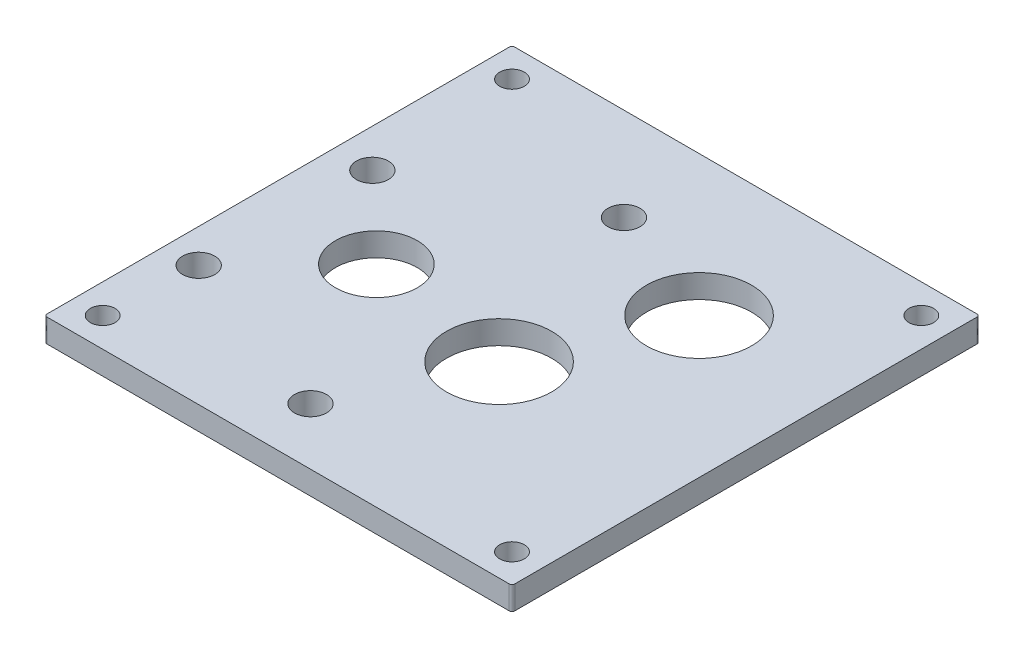
ISO-10303-21;
HEADER;
FILE_DESCRIPTION(('STEP AP214'),'2;1');
FILE_NAME('part.step','',(''),(''),'','','');
FILE_SCHEMA(('AUTOMOTIVE_DESIGN { 1 0 10303 214 1 1 1 1 }'));
ENDSEC;
DATA;
#1=APPLICATION_CONTEXT('core data for automotive mechanical design processes');
#2=APPLICATION_PROTOCOL_DEFINITION('international standard','automotive_design',2000,#1);
#3=PRODUCT_CONTEXT('',#1,'mechanical');
#4=PRODUCT('Part','Part','',(#3));
#5=PRODUCT_RELATED_PRODUCT_CATEGORY('part','',(#4));
#6=PRODUCT_DEFINITION_FORMATION('','',#4);
#7=PRODUCT_DEFINITION_CONTEXT('part definition',#1,'design');
#8=PRODUCT_DEFINITION('design','',#6,#7);
#9=PRODUCT_DEFINITION_SHAPE('','',#8);
#10=(LENGTH_UNIT() NAMED_UNIT(*) SI_UNIT(.MILLI.,.METRE.));
#11=(NAMED_UNIT(*) PLANE_ANGLE_UNIT() SI_UNIT($,.RADIAN.));
#12=(NAMED_UNIT(*) SI_UNIT($,.STERADIAN.) SOLID_ANGLE_UNIT());
#13=UNCERTAINTY_MEASURE_WITH_UNIT(LENGTH_MEASURE(1.E-05),#10,'distance_accuracy_value','');
#14=(GEOMETRIC_REPRESENTATION_CONTEXT(3) GLOBAL_UNCERTAINTY_ASSIGNED_CONTEXT((#13)) GLOBAL_UNIT_ASSIGNED_CONTEXT((#10,
#11,#12)) REPRESENTATION_CONTEXT('',''));
#15=CARTESIAN_POINT('',(0.,0.,0.));
#16=DIRECTION('',(0.,0.,1.));
#17=DIRECTION('',(1.,0.,0.));
#18=AXIS2_PLACEMENT_3D('',#15,#16,#17);
#19=CARTESIAN_POINT('',(126.238,-6.35,126.238));
#20=DIRECTION('',(0.,-1.,0.));
#21=DIRECTION('',(0.,0.,-1.));
#22=AXIS2_PLACEMENT_3D('',#19,#20,#21);
#23=CYLINDRICAL_SURFACE('',#22,0.762);
#24=CARTESIAN_POINT('',(126.238,0.,126.238));
#25=DIRECTION('',(0.,-1.,0.));
#26=DIRECTION('',(0.,0.,-1.));
#27=AXIS2_PLACEMENT_3D('',#24,#25,#26);
#28=CIRCLE('',#27,0.762);
#29=CARTESIAN_POINT('',(126.238,0.,127.));
#30=VERTEX_POINT('',#29);
#31=CARTESIAN_POINT('',(127.,0.,126.238));
#32=VERTEX_POINT('',#31);
#33=EDGE_CURVE('E101',#30,#32,#28,.F.);
#34=ORIENTED_EDGE('',*,*,#33,.F.);
#35=DIRECTION('',(0.,1.,0.));
#36=VECTOR('',#35,1.);
#37=CARTESIAN_POINT('',(126.238,-6.35,127.));
#38=LINE('',#37,#36);
#39=CARTESIAN_POINT('',(126.238,-6.35,127.));
#40=VERTEX_POINT('',#39);
#41=EDGE_CURVE('E127',#40,#30,#38,.T.);
#42=ORIENTED_EDGE('',*,*,#41,.F.);
#43=CARTESIAN_POINT('',(126.238,-6.35,126.238));
#44=DIRECTION('',(0.,-1.,0.));
#45=DIRECTION('',(0.,0.,-1.));
#46=AXIS2_PLACEMENT_3D('',#43,#44,#45);
#47=CIRCLE('',#46,0.762);
#48=CARTESIAN_POINT('',(127.,-6.35,126.238));
#49=VERTEX_POINT('',#48);
#50=EDGE_CURVE('E20',#40,#49,#47,.F.);
#51=ORIENTED_EDGE('',*,*,#50,.T.);
#52=DIRECTION('',(0.,1.,0.));
#53=VECTOR('',#52,1.);
#54=CARTESIAN_POINT('',(127.,-6.35,126.238));
#55=LINE('',#54,#53);
#56=EDGE_CURVE('E111',#32,#49,#55,.F.);
#57=ORIENTED_EDGE('',*,*,#56,.F.);
#58=EDGE_LOOP('',(#34,#42,#51,#57));
#59=FACE_BOUND('',#58,.T.);
#60=ADVANCED_FACE('F17',(#59),#23,.T.);
#61=CARTESIAN_POINT('',(126.238,-6.35,0.762000000000013));
#62=DIRECTION('',(0.,-1.,0.));
#63=DIRECTION('',(0.,0.,-1.));
#64=AXIS2_PLACEMENT_3D('',#61,#62,#63);
#65=CYLINDRICAL_SURFACE('',#64,0.762);
#66=CARTESIAN_POINT('',(126.238,0.,0.762000000000013));
#67=DIRECTION('',(0.,-1.,0.));
#68=DIRECTION('',(0.,0.,-1.));
#69=AXIS2_PLACEMENT_3D('',#66,#67,#68);
#70=CIRCLE('',#69,0.762);
#71=CARTESIAN_POINT('',(127.,0.,0.762000000000013));
#72=VERTEX_POINT('',#71);
#73=CARTESIAN_POINT('',(126.238,0.,0.));
#74=VERTEX_POINT('',#73);
#75=EDGE_CURVE('E89',#72,#74,#70,.F.);
#76=ORIENTED_EDGE('',*,*,#75,.F.);
#77=DIRECTION('',(0.,1.,0.));
#78=VECTOR('',#77,1.);
#79=CARTESIAN_POINT('',(127.,-6.35,0.762000000000013));
#80=LINE('',#79,#78);
#81=CARTESIAN_POINT('',(127.,-6.35,0.762000000000013));
#82=VERTEX_POINT('',#81);
#83=EDGE_CURVE('E92',#82,#72,#80,.T.);
#84=ORIENTED_EDGE('',*,*,#83,.F.);
#85=CARTESIAN_POINT('',(126.238,-6.35,0.762000000000013));
#86=DIRECTION('',(0.,-1.,0.));
#87=DIRECTION('',(0.,0.,-1.));
#88=AXIS2_PLACEMENT_3D('',#85,#86,#87);
#89=CIRCLE('',#88,0.762);
#90=CARTESIAN_POINT('',(126.238,-6.35,0.));
#91=VERTEX_POINT('',#90);
#92=EDGE_CURVE('E199',#82,#91,#89,.F.);
#93=ORIENTED_EDGE('',*,*,#92,.T.);
#94=DIRECTION('',(0.,1.,0.));
#95=VECTOR('',#94,1.);
#96=CARTESIAN_POINT('',(126.238,-6.35,0.));
#97=LINE('',#96,#95);
#98=EDGE_CURVE('E95',#74,#91,#97,.F.);
#99=ORIENTED_EDGE('',*,*,#98,.F.);
#100=EDGE_LOOP('',(#76,#84,#93,#99));
#101=FACE_BOUND('',#100,.T.);
#102=ADVANCED_FACE('F91',(#101),#65,.T.);
#103=CARTESIAN_POINT('',(0.762000000000013,-6.35,0.762000000000007));
#104=DIRECTION('',(0.,-1.,0.));
#105=DIRECTION('',(0.,0.,-1.));
#106=AXIS2_PLACEMENT_3D('',#103,#104,#105);
#107=CYLINDRICAL_SURFACE('',#106,0.762);
#108=CARTESIAN_POINT('',(0.762000000000013,0.,0.762000000000007));
#109=DIRECTION('',(0.,-1.,0.));
#110=DIRECTION('',(0.,0.,-1.));
#111=AXIS2_PLACEMENT_3D('',#108,#109,#110);
#112=CIRCLE('',#111,0.762);
#113=CARTESIAN_POINT('',(0.762000000000013,0.,0.));
#114=VERTEX_POINT('',#113);
#115=CARTESIAN_POINT('',(0.,0.,0.762000000000007));
#116=VERTEX_POINT('',#115);
#117=EDGE_CURVE('E196',#114,#116,#112,.F.);
#118=ORIENTED_EDGE('',*,*,#117,.F.);
#119=DIRECTION('',(0.,1.,0.));
#120=VECTOR('',#119,1.);
#121=CARTESIAN_POINT('',(0.762000000000013,-6.35,0.));
#122=LINE('',#121,#120);
#123=CARTESIAN_POINT('',(0.762000000000013,-6.35,0.));
#124=VERTEX_POINT('',#123);
#125=EDGE_CURVE('E110',#124,#114,#122,.T.);
#126=ORIENTED_EDGE('',*,*,#125,.F.);
#127=CARTESIAN_POINT('',(0.762000000000013,-6.35,0.762000000000007));
#128=DIRECTION('',(0.,-1.,0.));
#129=DIRECTION('',(0.,0.,-1.));
#130=AXIS2_PLACEMENT_3D('',#127,#128,#129);
#131=CIRCLE('',#130,0.762);
#132=CARTESIAN_POINT('',(0.,-6.35,0.762000000000008));
#133=VERTEX_POINT('',#132);
#134=EDGE_CURVE('E35',#124,#133,#131,.F.);
#135=ORIENTED_EDGE('',*,*,#134,.T.);
#136=DIRECTION('',(0.,1.,0.));
#137=VECTOR('',#136,1.);
#138=CARTESIAN_POINT('',(0.,-6.35,0.762000000000007));
#139=LINE('',#138,#137);
#140=EDGE_CURVE('E212',#116,#133,#139,.F.);
#141=ORIENTED_EDGE('',*,*,#140,.F.);
#142=EDGE_LOOP('',(#118,#126,#135,#141));
#143=FACE_BOUND('',#142,.T.);
#144=ADVANCED_FACE('F226',(#143),#107,.T.);
#145=CARTESIAN_POINT('',(0.762,-6.35,126.238));
#146=DIRECTION('',(0.,-1.,0.));
#147=DIRECTION('',(0.,0.,-1.));
#148=AXIS2_PLACEMENT_3D('',#145,#146,#147);
#149=CYLINDRICAL_SURFACE('',#148,0.762);
#150=CARTESIAN_POINT('',(0.762,0.,126.238));
#151=DIRECTION('',(0.,-1.,0.));
#152=DIRECTION('',(0.,0.,-1.));
#153=AXIS2_PLACEMENT_3D('',#150,#151,#152);
#154=CIRCLE('',#153,0.762);
#155=CARTESIAN_POINT('',(0.,0.,126.238));
#156=VERTEX_POINT('',#155);
#157=CARTESIAN_POINT('',(0.762,0.,127.));
#158=VERTEX_POINT('',#157);
#159=EDGE_CURVE('E194',#156,#158,#154,.F.);
#160=ORIENTED_EDGE('',*,*,#159,.F.);
#161=DIRECTION('',(0.,1.,0.));
#162=VECTOR('',#161,1.);
#163=CARTESIAN_POINT('',(0.,-6.35,126.238));
#164=LINE('',#163,#162);
#165=CARTESIAN_POINT('',(0.,-6.35,126.238));
#166=VERTEX_POINT('',#165);
#167=EDGE_CURVE('E178',#166,#156,#164,.T.);
#168=ORIENTED_EDGE('',*,*,#167,.F.);
#169=CARTESIAN_POINT('',(0.762,-6.35,126.238));
#170=DIRECTION('',(0.,-1.,0.));
#171=DIRECTION('',(0.,0.,-1.));
#172=AXIS2_PLACEMENT_3D('',#169,#170,#171);
#173=CIRCLE('',#172,0.762);
#174=CARTESIAN_POINT('',(0.762,-6.35,127.));
#175=VERTEX_POINT('',#174);
#176=EDGE_CURVE('E59',#166,#175,#173,.F.);
#177=ORIENTED_EDGE('',*,*,#176,.T.);
#178=DIRECTION('',(0.,1.,0.));
#179=VECTOR('',#178,1.);
#180=CARTESIAN_POINT('',(0.762,-6.35,127.));
#181=LINE('',#180,#179);
#182=EDGE_CURVE('E117',#158,#175,#181,.F.);
#183=ORIENTED_EDGE('',*,*,#182,.F.);
#184=EDGE_LOOP('',(#160,#168,#177,#183));
#185=FACE_BOUND('',#184,.T.);
#186=ADVANCED_FACE('F229',(#185),#149,.T.);
#187=CARTESIAN_POINT('',(0.,0.,127.));
#188=DIRECTION('',(0.,1.,0.));
#189=DIRECTION('',(0.,0.,1.));
#190=AXIS2_PLACEMENT_3D('',#187,#188,#189);
#191=PLANE('',#190);
#192=CARTESIAN_POINT('',(7.9248,0.,119.0752));
#193=DIRECTION('',(0.,1.,0.));
#194=DIRECTION('',(0.,0.,1.));
#195=AXIS2_PLACEMENT_3D('',#192,#193,#194);
#196=CIRCLE('',#195,3.3528);
#197=CARTESIAN_POINT('',(7.9248,0.,122.428));
#198=VERTEX_POINT('',#197);
#199=EDGE_CURVE('E160',#198,#198,#196,.F.);
#200=ORIENTED_EDGE('',*,*,#199,.T.);
#201=EDGE_LOOP('',(#200));
#202=FACE_BOUND('',#201,.T.);
#203=CARTESIAN_POINT('',(119.0752,0.,7.92480000000001));
#204=DIRECTION('',(0.,1.,0.));
#205=DIRECTION('',(0.,0.,1.));
#206=AXIS2_PLACEMENT_3D('',#203,#204,#205);
#207=CIRCLE('',#206,3.3528);
#208=CARTESIAN_POINT('',(119.0752,0.,11.2776));
#209=VERTEX_POINT('',#208);
#210=EDGE_CURVE('E163',#209,#209,#207,.F.);
#211=ORIENTED_EDGE('',*,*,#210,.T.);
#212=EDGE_LOOP('',(#211));
#213=FACE_BOUND('',#212,.T.);
#214=CARTESIAN_POINT('',(88.8962822014544,0.,38.1));
#215=DIRECTION('',(0.,1.,0.));
#216=DIRECTION('',(0.,0.,1.));
#217=AXIS2_PLACEMENT_3D('',#214,#215,#216);
#218=CIRCLE('',#217,14.28115);
#219=CARTESIAN_POINT('',(88.8962822014544,0.,52.38115));
#220=VERTEX_POINT('',#219);
#221=EDGE_CURVE('E166',#220,#220,#218,.F.);
#222=ORIENTED_EDGE('',*,*,#221,.T.);
#223=EDGE_LOOP('',(#222));
#224=FACE_BOUND('',#223,.T.);
#225=CARTESIAN_POINT('',(10.3884342856154,0.,48.3105586933845));
#226=DIRECTION('',(0.,1.,0.));
#227=DIRECTION('',(0.,0.,1.));
#228=AXIS2_PLACEMENT_3D('',#225,#226,#227);
#229=CIRCLE('',#228,4.3561);
#230=CARTESIAN_POINT('',(10.3884342856154,0.,52.6666586933845));
#231=VERTEX_POINT('',#230);
#232=EDGE_CURVE('E169',#231,#231,#229,.F.);
#233=ORIENTED_EDGE('',*,*,#232,.T.);
#234=EDGE_LOOP('',(#233));
#235=FACE_BOUND('',#234,.T.);
#236=CARTESIAN_POINT('',(9.15180743203793,0.,94.233488359528));
#237=DIRECTION('',(0.,1.,0.));
#238=DIRECTION('',(0.,0.,1.));
#239=AXIS2_PLACEMENT_3D('',#236,#237,#238);
#240=CIRCLE('',#239,4.3561);
#241=CARTESIAN_POINT('',(9.15180743203793,0.,98.589588359528));
#242=VERTEX_POINT('',#241);
#243=EDGE_CURVE('E172',#242,#242,#240,.F.);
#244=ORIENTED_EDGE('',*,*,#243,.T.);
#245=EDGE_LOOP('',(#244));
#246=FACE_BOUND('',#245,.T.);
#247=CARTESIAN_POINT('',(33.02,0.,69.85));
#248=DIRECTION('',(0.,1.,0.));
#249=DIRECTION('',(0.,0.,1.));
#250=AXIS2_PLACEMENT_3D('',#247,#248,#249);
#251=CIRCLE('',#250,11.10615);
#252=CARTESIAN_POINT('',(33.02,0.,80.95615));
#253=VERTEX_POINT('',#252);
#254=EDGE_CURVE('E175',#253,#253,#251,.F.);
#255=ORIENTED_EDGE('',*,*,#254,.T.);
#256=EDGE_LOOP('',(#255));
#257=FACE_BOUND('',#256,.T.);
#258=DIRECTION('',(0.,0.,-1.));
#259=VECTOR('',#258,1.);
#260=CARTESIAN_POINT('',(127.,0.,127.));
#261=LINE('',#260,#259);
#262=EDGE_CURVE('E107',#72,#32,#261,.F.);
#263=ORIENTED_EDGE('',*,*,#262,.F.);
#264=ORIENTED_EDGE('',*,*,#75,.T.);
#265=DIRECTION('',(-1.,0.,0.));
#266=VECTOR('',#265,1.);
#267=CARTESIAN_POINT('',(127.,0.,0.));
#268=LINE('',#267,#266);
#269=EDGE_CURVE('E124',#114,#74,#268,.F.);
#270=ORIENTED_EDGE('',*,*,#269,.F.);
#271=ORIENTED_EDGE('',*,*,#117,.T.);
#272=DIRECTION('',(0.,0.,1.));
#273=VECTOR('',#272,1.);
#274=CARTESIAN_POINT('',(0.,0.,0.));
#275=LINE('',#274,#273);
#276=EDGE_CURVE('E214',#156,#116,#275,.F.);
#277=ORIENTED_EDGE('',*,*,#276,.F.);
#278=ORIENTED_EDGE('',*,*,#159,.T.);
#279=DIRECTION('',(1.,0.,0.));
#280=VECTOR('',#279,1.);
#281=CARTESIAN_POINT('',(0.,0.,127.));
#282=LINE('',#281,#280);
#283=EDGE_CURVE('E120',#30,#158,#282,.F.);
#284=ORIENTED_EDGE('',*,*,#283,.F.);
#285=ORIENTED_EDGE('',*,*,#33,.T.);
#286=EDGE_LOOP('',(#263,#264,#270,#271,#277,#278,#284,#285));
#287=FACE_BOUND('',#286,.T.);
#288=CARTESIAN_POINT('',(55.6515657143845,0.,25.2478413066155));
#289=DIRECTION('',(0.,1.,0.));
#290=DIRECTION('',(0.,0.,1.));
#291=AXIS2_PLACEMENT_3D('',#288,#289,#290);
#292=CIRCLE('',#291,4.3561);
#293=CARTESIAN_POINT('',(55.6515657143845,0.,29.6039413066155));
#294=VERTEX_POINT('',#293);
#295=EDGE_CURVE('E179',#294,#294,#292,.F.);
#296=ORIENTED_EDGE('',*,*,#295,.T.);
#297=EDGE_LOOP('',(#296));
#298=FACE_BOUND('',#297,.T.);
#299=CARTESIAN_POINT('',(56.8881925679621,0.,111.608111640472));
#300=DIRECTION('',(0.,1.,0.));
#301=DIRECTION('',(0.,0.,1.));
#302=AXIS2_PLACEMENT_3D('',#299,#300,#301);
#303=CIRCLE('',#302,4.3561);
#304=CARTESIAN_POINT('',(56.8881925679621,0.,115.964211640472));
#305=VERTEX_POINT('',#304);
#306=EDGE_CURVE('E182',#305,#305,#303,.F.);
#307=ORIENTED_EDGE('',*,*,#306,.T.);
#308=EDGE_LOOP('',(#307));
#309=FACE_BOUND('',#308,.T.);
#310=CARTESIAN_POINT('',(72.5854471866552,0.,76.0984));
#311=DIRECTION('',(0.,1.,0.));
#312=DIRECTION('',(0.,0.,1.));
#313=AXIS2_PLACEMENT_3D('',#310,#311,#312);
#314=CIRCLE('',#313,14.28115);
#315=CARTESIAN_POINT('',(72.5854471866552,0.,90.37955));
#316=VERTEX_POINT('',#315);
#317=EDGE_CURVE('E185',#316,#316,#314,.F.);
#318=ORIENTED_EDGE('',*,*,#317,.T.);
#319=EDGE_LOOP('',(#318));
#320=FACE_BOUND('',#319,.T.);
#321=CARTESIAN_POINT('',(7.92480000000001,0.,7.92480000000001));
#322=DIRECTION('',(0.,1.,0.));
#323=DIRECTION('',(0.,0.,1.));
#324=AXIS2_PLACEMENT_3D('',#321,#322,#323);
#325=CIRCLE('',#324,3.3528);
#326=CARTESIAN_POINT('',(7.92480000000001,0.,11.2776));
#327=VERTEX_POINT('',#326);
#328=EDGE_CURVE('E188',#327,#327,#325,.F.);
#329=ORIENTED_EDGE('',*,*,#328,.T.);
#330=EDGE_LOOP('',(#329));
#331=FACE_BOUND('',#330,.T.);
#332=CARTESIAN_POINT('',(119.0752,0.,119.0752));
#333=DIRECTION('',(0.,1.,0.));
#334=DIRECTION('',(0.,0.,1.));
#335=AXIS2_PLACEMENT_3D('',#332,#333,#334);
#336=CIRCLE('',#335,3.3528);
#337=CARTESIAN_POINT('',(119.0752,0.,122.428));
#338=VERTEX_POINT('',#337);
#339=EDGE_CURVE('E100',#338,#338,#336,.F.);
#340=ORIENTED_EDGE('',*,*,#339,.T.);
#341=EDGE_LOOP('',(#340));
#342=FACE_BOUND('',#341,.T.);
#343=ADVANCED_FACE('F113',(#202,#213,#224,#235,#246,#257,#287,#298,#309,#320,#331,#342),#191,.T.);
#344=CARTESIAN_POINT('',(119.0752,173.367340565678,119.0752));
#345=DIRECTION('',(0.,1.,0.));
#346=DIRECTION('',(0.,0.,1.));
#347=AXIS2_PLACEMENT_3D('',#344,#345,#346);
#348=CYLINDRICAL_SURFACE('',#347,3.3528);
#349=ORIENTED_EDGE('',*,*,#339,.F.);
#350=EDGE_LOOP('',(#349));
#351=FACE_BOUND('',#350,.T.);
#352=CARTESIAN_POINT('',(119.0752,-6.34999999999999,119.0752));
#353=DIRECTION('',(0.,1.,0.));
#354=DIRECTION('',(0.,0.,1.));
#355=AXIS2_PLACEMENT_3D('',#352,#353,#354);
#356=CIRCLE('',#355,3.3528);
#357=CARTESIAN_POINT('',(119.0752,-6.34999999999999,122.428));
#358=VERTEX_POINT('',#357);
#359=EDGE_CURVE('E157',#358,#358,#356,.F.);
#360=ORIENTED_EDGE('',*,*,#359,.T.);
#361=EDGE_LOOP('',(#360));
#362=FACE_BOUND('',#361,.T.);
#363=ADVANCED_FACE('F349',(#351,#362),#348,.F.);
#364=CARTESIAN_POINT('',(7.92480000000001,173.367340565678,7.92480000000001));
#365=DIRECTION('',(0.,1.,0.));
#366=DIRECTION('',(0.,0.,1.));
#367=AXIS2_PLACEMENT_3D('',#364,#365,#366);
#368=CYLINDRICAL_SURFACE('',#367,3.3528);
#369=ORIENTED_EDGE('',*,*,#328,.F.);
#370=EDGE_LOOP('',(#369));
#371=FACE_BOUND('',#370,.T.);
#372=CARTESIAN_POINT('',(7.92480000000001,-6.34999999999999,7.92480000000001));
#373=DIRECTION('',(0.,1.,0.));
#374=DIRECTION('',(0.,0.,1.));
#375=AXIS2_PLACEMENT_3D('',#372,#373,#374);
#376=CIRCLE('',#375,3.3528);
#377=CARTESIAN_POINT('',(7.92480000000001,-6.34999999999999,11.2776));
#378=VERTEX_POINT('',#377);
#379=EDGE_CURVE('E154',#378,#378,#376,.F.);
#380=ORIENTED_EDGE('',*,*,#379,.T.);
#381=EDGE_LOOP('',(#380));
#382=FACE_BOUND('',#381,.T.);
#383=ADVANCED_FACE('F341',(#371,#382),#368,.F.);
#384=CARTESIAN_POINT('',(72.5854471866552,173.367340565678,76.0984));
#385=DIRECTION('',(0.,1.,0.));
#386=DIRECTION('',(0.,0.,1.));
#387=AXIS2_PLACEMENT_3D('',#384,#385,#386);
#388=CYLINDRICAL_SURFACE('',#387,14.28115);
#389=ORIENTED_EDGE('',*,*,#317,.F.);
#390=EDGE_LOOP('',(#389));
#391=FACE_BOUND('',#390,.T.);
#392=CARTESIAN_POINT('',(72.5854471866552,-6.34999999999999,76.0984));
#393=DIRECTION('',(0.,1.,0.));
#394=DIRECTION('',(0.,0.,1.));
#395=AXIS2_PLACEMENT_3D('',#392,#393,#394);
#396=CIRCLE('',#395,14.28115);
#397=CARTESIAN_POINT('',(72.5854471866552,-6.34999999999999,90.37955));
#398=VERTEX_POINT('',#397);
#399=EDGE_CURVE('E151',#398,#398,#396,.F.);
#400=ORIENTED_EDGE('',*,*,#399,.T.);
#401=EDGE_LOOP('',(#400));
#402=FACE_BOUND('',#401,.T.);
#403=ADVANCED_FACE('F333',(#391,#402),#388,.F.);
#404=CARTESIAN_POINT('',(56.8881925679621,173.367340565678,111.608111640472));
#405=DIRECTION('',(0.,1.,0.));
#406=DIRECTION('',(0.,0.,1.));
#407=AXIS2_PLACEMENT_3D('',#404,#405,#406);
#408=CYLINDRICAL_SURFACE('',#407,4.3561);
#409=ORIENTED_EDGE('',*,*,#306,.F.);
#410=EDGE_LOOP('',(#409));
#411=FACE_BOUND('',#410,.T.);
#412=CARTESIAN_POINT('',(56.8881925679621,-6.34999999999999,111.608111640472));
#413=DIRECTION('',(0.,1.,0.));
#414=DIRECTION('',(0.,0.,1.));
#415=AXIS2_PLACEMENT_3D('',#412,#413,#414);
#416=CIRCLE('',#415,4.3561);
#417=CARTESIAN_POINT('',(56.8881925679621,-6.34999999999999,115.964211640472));
#418=VERTEX_POINT('',#417);
#419=EDGE_CURVE('E148',#418,#418,#416,.F.);
#420=ORIENTED_EDGE('',*,*,#419,.T.);
#421=EDGE_LOOP('',(#420));
#422=FACE_BOUND('',#421,.T.);
#423=ADVANCED_FACE('F241',(#411,#422),#408,.F.);
#424=CARTESIAN_POINT('',(55.6515657143845,173.367340565678,25.2478413066155));
#425=DIRECTION('',(0.,1.,0.));
#426=DIRECTION('',(0.,0.,1.));
#427=AXIS2_PLACEMENT_3D('',#424,#425,#426);
#428=CYLINDRICAL_SURFACE('',#427,4.3561);
#429=ORIENTED_EDGE('',*,*,#295,.F.);
#430=EDGE_LOOP('',(#429));
#431=FACE_BOUND('',#430,.T.);
#432=CARTESIAN_POINT('',(55.6515657143845,-6.34999999999999,25.2478413066155));
#433=DIRECTION('',(0.,1.,0.));
#434=DIRECTION('',(0.,0.,1.));
#435=AXIS2_PLACEMENT_3D('',#432,#433,#434);
#436=CIRCLE('',#435,4.3561);
#437=CARTESIAN_POINT('',(55.6515657143845,-6.34999999999999,29.6039413066155));
#438=VERTEX_POINT('',#437);
#439=EDGE_CURVE('E144',#438,#438,#436,.F.);
#440=ORIENTED_EDGE('',*,*,#439,.T.);
#441=EDGE_LOOP('',(#440));
#442=FACE_BOUND('',#441,.T.);
#443=ADVANCED_FACE('F233',(#431,#442),#428,.F.);
#444=CARTESIAN_POINT('',(0.,-6.35,127.));
#445=DIRECTION('',(0.,0.,1.));
#446=DIRECTION('',(1.,0.,0.));
#447=AXIS2_PLACEMENT_3D('',#444,#445,#446);
#448=PLANE('',#447);
#449=ORIENTED_EDGE('',*,*,#283,.T.);
#450=ORIENTED_EDGE('',*,*,#182,.T.);
#451=DIRECTION('',(1.,0.,0.));
#452=VECTOR('',#451,1.);
#453=CARTESIAN_POINT('',(0.,-6.35,127.));
#454=LINE('',#453,#452);
#455=EDGE_CURVE('E147',#175,#40,#454,.T.);
#456=ORIENTED_EDGE('',*,*,#455,.T.);
#457=ORIENTED_EDGE('',*,*,#41,.T.);
#458=EDGE_LOOP('',(#449,#450,#456,#457));
#459=FACE_BOUND('',#458,.T.);
#460=ADVANCED_FACE('F231',(#459),#448,.T.);
#461=CARTESIAN_POINT('',(127.,-6.35,127.));
#462=DIRECTION('',(1.,0.,0.));
#463=DIRECTION('',(0.,0.,-1.));
#464=AXIS2_PLACEMENT_3D('',#461,#462,#463);
#465=PLANE('',#464);
#466=DIRECTION('',(0.,0.,1.));
#467=VECTOR('',#466,1.);
#468=CARTESIAN_POINT('',(127.,-6.35,127.));
#469=LINE('',#468,#467);
#470=EDGE_CURVE('E109',#49,#82,#469,.F.);
#471=ORIENTED_EDGE('',*,*,#470,.T.);
#472=ORIENTED_EDGE('',*,*,#83,.T.);
#473=ORIENTED_EDGE('',*,*,#262,.T.);
#474=ORIENTED_EDGE('',*,*,#56,.T.);
#475=EDGE_LOOP('',(#471,#472,#473,#474));
#476=FACE_BOUND('',#475,.T.);
#477=ADVANCED_FACE('F105',(#476),#465,.T.);
#478=CARTESIAN_POINT('',(127.,-6.35,0.));
#479=DIRECTION('',(0.,0.,-1.));
#480=DIRECTION('',(-1.,0.,0.));
#481=AXIS2_PLACEMENT_3D('',#478,#479,#480);
#482=PLANE('',#481);
#483=ORIENTED_EDGE('',*,*,#269,.T.);
#484=ORIENTED_EDGE('',*,*,#98,.T.);
#485=DIRECTION('',(1.,0.,0.));
#486=VECTOR('',#485,1.);
#487=CARTESIAN_POINT('',(0.,-6.35,0.));
#488=LINE('',#487,#486);
#489=EDGE_CURVE('E205',#91,#124,#488,.F.);
#490=ORIENTED_EDGE('',*,*,#489,.T.);
#491=ORIENTED_EDGE('',*,*,#125,.T.);
#492=EDGE_LOOP('',(#483,#484,#490,#491));
#493=FACE_BOUND('',#492,.T.);
#494=ADVANCED_FACE('F228',(#493),#482,.T.);
#495=CARTESIAN_POINT('',(0.,-6.35,0.));
#496=DIRECTION('',(-1.,0.,0.));
#497=DIRECTION('',(0.,0.,1.));
#498=AXIS2_PLACEMENT_3D('',#495,#496,#497);
#499=PLANE('',#498);
#500=DIRECTION('',(0.,0.,1.));
#501=VECTOR('',#500,1.);
#502=CARTESIAN_POINT('',(0.,-6.35,127.));
#503=LINE('',#502,#501);
#504=EDGE_CURVE('E143',#133,#166,#503,.T.);
#505=ORIENTED_EDGE('',*,*,#504,.T.);
#506=ORIENTED_EDGE('',*,*,#167,.T.);
#507=ORIENTED_EDGE('',*,*,#276,.T.);
#508=ORIENTED_EDGE('',*,*,#140,.T.);
#509=EDGE_LOOP('',(#505,#506,#507,#508));
#510=FACE_BOUND('',#509,.T.);
#511=ADVANCED_FACE('F223',(#510),#499,.T.);
#512=CARTESIAN_POINT('',(33.02,173.367340565678,69.85));
#513=DIRECTION('',(0.,1.,0.));
#514=DIRECTION('',(0.,0.,1.));
#515=AXIS2_PLACEMENT_3D('',#512,#513,#514);
#516=CYLINDRICAL_SURFACE('',#515,11.10615);
#517=ORIENTED_EDGE('',*,*,#254,.F.);
#518=EDGE_LOOP('',(#517));
#519=FACE_BOUND('',#518,.T.);
#520=CARTESIAN_POINT('',(33.02,-6.34999999999999,69.85));
#521=DIRECTION('',(0.,1.,0.));
#522=DIRECTION('',(0.,0.,1.));
#523=AXIS2_PLACEMENT_3D('',#520,#521,#522);
#524=CIRCLE('',#523,11.10615);
#525=CARTESIAN_POINT('',(33.02,-6.34999999999999,80.95615));
#526=VERTEX_POINT('',#525);
#527=EDGE_CURVE('E140',#526,#526,#524,.F.);
#528=ORIENTED_EDGE('',*,*,#527,.T.);
#529=EDGE_LOOP('',(#528));
#530=FACE_BOUND('',#529,.T.);
#531=ADVANCED_FACE('F271',(#519,#530),#516,.F.);
#532=CARTESIAN_POINT('',(9.15180743203793,173.367340565678,94.233488359528));
#533=DIRECTION('',(0.,1.,0.));
#534=DIRECTION('',(0.,0.,1.));
#535=AXIS2_PLACEMENT_3D('',#532,#533,#534);
#536=CYLINDRICAL_SURFACE('',#535,4.3561);
#537=ORIENTED_EDGE('',*,*,#243,.F.);
#538=EDGE_LOOP('',(#537));
#539=FACE_BOUND('',#538,.T.);
#540=CARTESIAN_POINT('',(9.15180743203793,-6.34999999999999,94.233488359528));
#541=DIRECTION('',(0.,1.,0.));
#542=DIRECTION('',(0.,0.,1.));
#543=AXIS2_PLACEMENT_3D('',#540,#541,#542);
#544=CIRCLE('',#543,4.3561);
#545=CARTESIAN_POINT('',(9.15180743203793,-6.34999999999999,98.589588359528));
#546=VERTEX_POINT('',#545);
#547=EDGE_CURVE('E137',#546,#546,#544,.F.);
#548=ORIENTED_EDGE('',*,*,#547,.T.);
#549=EDGE_LOOP('',(#548));
#550=FACE_BOUND('',#549,.T.);
#551=ADVANCED_FACE('F267',(#539,#550),#536,.F.);
#552=CARTESIAN_POINT('',(10.3884342856154,173.367340565678,48.3105586933845));
#553=DIRECTION('',(0.,1.,0.));
#554=DIRECTION('',(0.,0.,1.));
#555=AXIS2_PLACEMENT_3D('',#552,#553,#554);
#556=CYLINDRICAL_SURFACE('',#555,4.3561);
#557=ORIENTED_EDGE('',*,*,#232,.F.);
#558=EDGE_LOOP('',(#557));
#559=FACE_BOUND('',#558,.T.);
#560=CARTESIAN_POINT('',(10.3884342856154,-6.34999999999999,48.3105586933845));
#561=DIRECTION('',(0.,1.,0.));
#562=DIRECTION('',(0.,0.,1.));
#563=AXIS2_PLACEMENT_3D('',#560,#561,#562);
#564=CIRCLE('',#563,4.3561);
#565=CARTESIAN_POINT('',(10.3884342856154,-6.34999999999999,52.6666586933845));
#566=VERTEX_POINT('',#565);
#567=EDGE_CURVE('E134',#566,#566,#564,.F.);
#568=ORIENTED_EDGE('',*,*,#567,.T.);
#569=EDGE_LOOP('',(#568));
#570=FACE_BOUND('',#569,.T.);
#571=ADVANCED_FACE('F263',(#559,#570),#556,.F.);
#572=CARTESIAN_POINT('',(88.8962822014544,173.367340565678,38.1));
#573=DIRECTION('',(0.,1.,0.));
#574=DIRECTION('',(0.,0.,1.));
#575=AXIS2_PLACEMENT_3D('',#572,#573,#574);
#576=CYLINDRICAL_SURFACE('',#575,14.28115);
#577=ORIENTED_EDGE('',*,*,#221,.F.);
#578=EDGE_LOOP('',(#577));
#579=FACE_BOUND('',#578,.T.);
#580=CARTESIAN_POINT('',(88.8962822014544,-6.34999999999999,38.1));
#581=DIRECTION('',(0.,1.,0.));
#582=DIRECTION('',(0.,0.,1.));
#583=AXIS2_PLACEMENT_3D('',#580,#581,#582);
#584=CIRCLE('',#583,14.28115);
#585=CARTESIAN_POINT('',(88.8962822014544,-6.34999999999999,52.38115));
#586=VERTEX_POINT('',#585);
#587=EDGE_CURVE('E131',#586,#586,#584,.F.);
#588=ORIENTED_EDGE('',*,*,#587,.T.);
#589=EDGE_LOOP('',(#588));
#590=FACE_BOUND('',#589,.T.);
#591=ADVANCED_FACE('F259',(#579,#590),#576,.F.);
#592=CARTESIAN_POINT('',(119.0752,173.367340565678,7.92480000000001));
#593=DIRECTION('',(0.,1.,0.));
#594=DIRECTION('',(0.,0.,1.));
#595=AXIS2_PLACEMENT_3D('',#592,#593,#594);
#596=CYLINDRICAL_SURFACE('',#595,3.3528);
#597=ORIENTED_EDGE('',*,*,#210,.F.);
#598=EDGE_LOOP('',(#597));
#599=FACE_BOUND('',#598,.T.);
#600=CARTESIAN_POINT('',(119.0752,-6.34999999999999,7.92480000000001));
#601=DIRECTION('',(0.,1.,0.));
#602=DIRECTION('',(0.,0.,1.));
#603=AXIS2_PLACEMENT_3D('',#600,#601,#602);
#604=CIRCLE('',#603,3.3528);
#605=CARTESIAN_POINT('',(119.0752,-6.34999999999999,11.2776));
#606=VERTEX_POINT('',#605);
#607=EDGE_CURVE('E26',#606,#606,#604,.F.);
#608=ORIENTED_EDGE('',*,*,#607,.T.);
#609=EDGE_LOOP('',(#608));
#610=FACE_BOUND('',#609,.T.);
#611=ADVANCED_FACE('F251',(#599,#610),#596,.F.);
#612=CARTESIAN_POINT('',(7.9248,173.367340565678,119.0752));
#613=DIRECTION('',(0.,1.,0.));
#614=DIRECTION('',(0.,0.,1.));
#615=AXIS2_PLACEMENT_3D('',#612,#613,#614);
#616=CYLINDRICAL_SURFACE('',#615,3.3528);
#617=ORIENTED_EDGE('',*,*,#199,.F.);
#618=EDGE_LOOP('',(#617));
#619=FACE_BOUND('',#618,.T.);
#620=CARTESIAN_POINT('',(7.9248,-6.34999999999999,119.0752));
#621=DIRECTION('',(0.,1.,0.));
#622=DIRECTION('',(0.,0.,1.));
#623=AXIS2_PLACEMENT_3D('',#620,#621,#622);
#624=CIRCLE('',#623,3.3528);
#625=CARTESIAN_POINT('',(7.9248,-6.34999999999999,122.428));
#626=VERTEX_POINT('',#625);
#627=EDGE_CURVE('E11',#626,#626,#624,.F.);
#628=ORIENTED_EDGE('',*,*,#627,.T.);
#629=EDGE_LOOP('',(#628));
#630=FACE_BOUND('',#629,.T.);
#631=ADVANCED_FACE('F245',(#619,#630),#616,.F.);
#632=CARTESIAN_POINT('',(0.,-6.35,127.));
#633=DIRECTION('',(0.,1.,0.));
#634=DIRECTION('',(0.,0.,1.));
#635=AXIS2_PLACEMENT_3D('',#632,#633,#634);
#636=PLANE('',#635);
#637=ORIENTED_EDGE('',*,*,#627,.F.);
#638=EDGE_LOOP('',(#637));
#639=FACE_BOUND('',#638,.T.);
#640=ORIENTED_EDGE('',*,*,#607,.F.);
#641=EDGE_LOOP('',(#640));
#642=FACE_BOUND('',#641,.T.);
#643=ORIENTED_EDGE('',*,*,#587,.F.);
#644=EDGE_LOOP('',(#643));
#645=FACE_BOUND('',#644,.T.);
#646=ORIENTED_EDGE('',*,*,#567,.F.);
#647=EDGE_LOOP('',(#646));
#648=FACE_BOUND('',#647,.T.);
#649=ORIENTED_EDGE('',*,*,#547,.F.);
#650=EDGE_LOOP('',(#649));
#651=FACE_BOUND('',#650,.T.);
#652=ORIENTED_EDGE('',*,*,#527,.F.);
#653=EDGE_LOOP('',(#652));
#654=FACE_BOUND('',#653,.T.);
#655=ORIENTED_EDGE('',*,*,#134,.F.);
#656=ORIENTED_EDGE('',*,*,#489,.F.);
#657=ORIENTED_EDGE('',*,*,#92,.F.);
#658=ORIENTED_EDGE('',*,*,#470,.F.);
#659=ORIENTED_EDGE('',*,*,#50,.F.);
#660=ORIENTED_EDGE('',*,*,#455,.F.);
#661=ORIENTED_EDGE('',*,*,#176,.F.);
#662=ORIENTED_EDGE('',*,*,#504,.F.);
#663=EDGE_LOOP('',(#655,#656,#657,#658,#659,#660,#661,#662));
#664=FACE_BOUND('',#663,.T.);
#665=ORIENTED_EDGE('',*,*,#439,.F.);
#666=EDGE_LOOP('',(#665));
#667=FACE_BOUND('',#666,.T.);
#668=ORIENTED_EDGE('',*,*,#419,.F.);
#669=EDGE_LOOP('',(#668));
#670=FACE_BOUND('',#669,.T.);
#671=ORIENTED_EDGE('',*,*,#399,.F.);
#672=EDGE_LOOP('',(#671));
#673=FACE_BOUND('',#672,.T.);
#674=ORIENTED_EDGE('',*,*,#379,.F.);
#675=EDGE_LOOP('',(#674));
#676=FACE_BOUND('',#675,.T.);
#677=ORIENTED_EDGE('',*,*,#359,.F.);
#678=EDGE_LOOP('',(#677));
#679=FACE_BOUND('',#678,.T.);
#680=ADVANCED_FACE('F202',(#639,#642,#645,#648,#651,#654,#664,#667,#670,#673,#676,#679),#636,.F.);
#681=CLOSED_SHELL('',(#60,#102,#144,#186,#343,#363,#383,#403,#423,#443,#460,#477,#494,#511,#531,
#551,#571,#591,#611,#631,#680));
#682=MANIFOLD_SOLID_BREP('B1',#681);
#683=ADVANCED_BREP_SHAPE_REPRESENTATION('',(#18,#682),#14);
#684=SHAPE_DEFINITION_REPRESENTATION(#9,#683);
ENDSEC;
END-ISO-10303-21;
